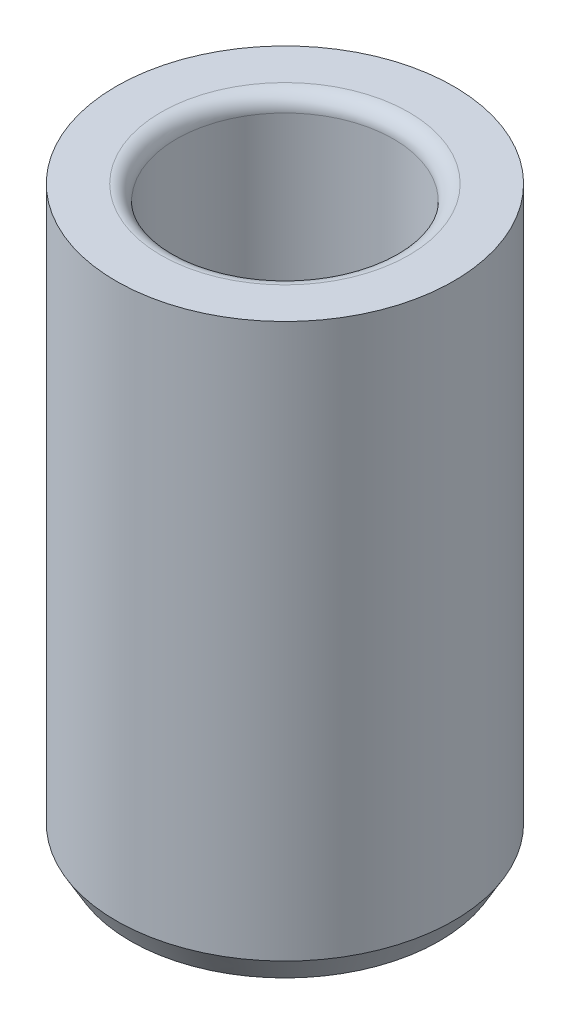
ISO-10303-21;
HEADER;
FILE_DESCRIPTION(('STEP AP214'),'2;1');
FILE_NAME('part.step','',(''),(''),'','','');
FILE_SCHEMA(('AUTOMOTIVE_DESIGN { 1 0 10303 214 1 1 1 1 }'));
ENDSEC;
DATA;
#1=APPLICATION_CONTEXT('core data for automotive mechanical design processes');
#2=APPLICATION_PROTOCOL_DEFINITION('international standard','automotive_design',2000,#1);
#3=PRODUCT_CONTEXT('',#1,'mechanical');
#4=PRODUCT('Part','Part','',(#3));
#5=PRODUCT_RELATED_PRODUCT_CATEGORY('part','',(#4));
#6=PRODUCT_DEFINITION_FORMATION('','',#4);
#7=PRODUCT_DEFINITION_CONTEXT('part definition',#1,'design');
#8=PRODUCT_DEFINITION('design','',#6,#7);
#9=PRODUCT_DEFINITION_SHAPE('','',#8);
#10=(LENGTH_UNIT() NAMED_UNIT(*) SI_UNIT(.MILLI.,.METRE.));
#11=(NAMED_UNIT(*) PLANE_ANGLE_UNIT() SI_UNIT($,.RADIAN.));
#12=(NAMED_UNIT(*) SI_UNIT($,.STERADIAN.) SOLID_ANGLE_UNIT());
#13=UNCERTAINTY_MEASURE_WITH_UNIT(LENGTH_MEASURE(1.E-05),#10,'distance_accuracy_value','');
#14=(GEOMETRIC_REPRESENTATION_CONTEXT(3) GLOBAL_UNCERTAINTY_ASSIGNED_CONTEXT((#13)) GLOBAL_UNIT_ASSIGNED_CONTEXT((#10,
#11,#12)) REPRESENTATION_CONTEXT('',''));
#15=CARTESIAN_POINT('',(0.,0.,0.));
#16=DIRECTION('',(0.,0.,1.));
#17=DIRECTION('',(1.,0.,0.));
#18=AXIS2_PLACEMENT_3D('',#15,#16,#17);
#19=CARTESIAN_POINT('',(0.,0.,0.));
#20=DIRECTION('',(0.,1.,0.));
#21=DIRECTION('',(-1.,0.,0.));
#22=AXIS2_PLACEMENT_3D('',#19,#20,#21);
#23=CYLINDRICAL_SURFACE('',#22,5.55625);
#24=CARTESIAN_POINT('',(0.,-18.2372,0.));
#25=DIRECTION('',(0.,1.,0.));
#26=DIRECTION('',(-1.,0.,0.));
#27=AXIS2_PLACEMENT_3D('',#24,#25,#26);
#28=CIRCLE('',#27,5.55625);
#29=CARTESIAN_POINT('',(-5.55625,-18.2372,0.));
#30=VERTEX_POINT('',#29);
#31=EDGE_CURVE('E40',#30,#30,#28,.T.);
#32=ORIENTED_EDGE('',*,*,#31,.T.);
#33=EDGE_LOOP('',(#32));
#34=FACE_BOUND('',#33,.T.);
#35=CARTESIAN_POINT('',(0.,0.,0.));
#36=DIRECTION('',(0.,1.,0.));
#37=DIRECTION('',(-1.,0.,0.));
#38=AXIS2_PLACEMENT_3D('',#35,#36,#37);
#39=CIRCLE('',#38,5.55625);
#40=CARTESIAN_POINT('',(-5.55625,0.,0.));
#41=VERTEX_POINT('',#40);
#42=EDGE_CURVE('E44',#41,#41,#39,.T.);
#43=ORIENTED_EDGE('',*,*,#42,.F.);
#44=EDGE_LOOP('',(#43));
#45=FACE_BOUND('',#44,.T.);
#46=ADVANCED_FACE('F33',(#34,#45),#23,.T.);
#47=CARTESIAN_POINT('',(4.079875,0.,0.));
#48=DIRECTION('',(0.,-1.,0.));
#49=DIRECTION('',(1.,0.,0.));
#50=AXIS2_PLACEMENT_3D('',#47,#48,#49);
#51=PLANE('',#50);
#52=CARTESIAN_POINT('',(0.,0.,0.));
#53=DIRECTION('',(0.,1.,0.));
#54=DIRECTION('',(-1.,0.,0.));
#55=AXIS2_PLACEMENT_3D('',#52,#53,#54);
#56=CIRCLE('',#55,4.079875);
#57=CARTESIAN_POINT('',(-4.079875,0.,0.));
#58=VERTEX_POINT('',#57);
#59=EDGE_CURVE('E48',#58,#58,#56,.T.);
#60=ORIENTED_EDGE('',*,*,#59,.F.);
#61=EDGE_LOOP('',(#60));
#62=FACE_BOUND('',#61,.T.);
#63=ORIENTED_EDGE('',*,*,#42,.T.);
#64=EDGE_LOOP('',(#63));
#65=FACE_BOUND('',#64,.T.);
#66=ADVANCED_FACE('F80',(#62,#65),#51,.F.);
#67=CARTESIAN_POINT('',(0.,-0.508000000000001,0.));
#68=DIRECTION('',(0.,1.,0.));
#69=DIRECTION('',(-1.,0.,0.));
#70=AXIS2_PLACEMENT_3D('',#67,#68,#69);
#71=TOROIDAL_SURFACE('',#70,4.079875,0.508);
#72=CARTESIAN_POINT('',(0.,-0.508000000000001,0.));
#73=DIRECTION('',(0.,1.,0.));
#74=DIRECTION('',(-1.,0.,0.));
#75=AXIS2_PLACEMENT_3D('',#72,#73,#74);
#76=CIRCLE('',#75,3.571875);
#77=CARTESIAN_POINT('',(-3.571875,-0.508000000000001,0.));
#78=VERTEX_POINT('',#77);
#79=EDGE_CURVE('E53',#78,#78,#76,.T.);
#80=ORIENTED_EDGE('',*,*,#79,.F.);
#81=EDGE_LOOP('',(#80));
#82=FACE_BOUND('',#81,.T.);
#83=ORIENTED_EDGE('',*,*,#59,.T.);
#84=EDGE_LOOP('',(#83));
#85=FACE_BOUND('',#84,.T.);
#86=ADVANCED_FACE('F74',(#82,#85),#71,.T.);
#87=CARTESIAN_POINT('',(0.,0.,0.));
#88=DIRECTION('',(0.,1.,0.));
#89=DIRECTION('',(-1.,0.,0.));
#90=AXIS2_PLACEMENT_3D('',#87,#88,#89);
#91=CYLINDRICAL_SURFACE('',#90,3.571875);
#92=CARTESIAN_POINT('',(0.,-18.669,0.));
#93=DIRECTION('',(0.,1.,0.));
#94=DIRECTION('',(-1.,0.,0.));
#95=AXIS2_PLACEMENT_3D('',#92,#93,#94);
#96=CIRCLE('',#95,3.571875);
#97=CARTESIAN_POINT('',(-3.571875,-18.669,0.));
#98=VERTEX_POINT('',#97);
#99=EDGE_CURVE('E56',#98,#98,#96,.T.);
#100=ORIENTED_EDGE('',*,*,#99,.F.);
#101=EDGE_LOOP('',(#100));
#102=FACE_BOUND('',#101,.T.);
#103=ORIENTED_EDGE('',*,*,#79,.T.);
#104=EDGE_LOOP('',(#103));
#105=FACE_BOUND('',#104,.T.);
#106=ADVANCED_FACE('F68',(#102,#105),#91,.F.);
#107=CARTESIAN_POINT('',(0.,-18.669,0.));
#108=DIRECTION('',(0.,-1.,0.));
#109=DIRECTION('',(1.,0.,0.));
#110=AXIS2_PLACEMENT_3D('',#107,#108,#109);
#111=CONICAL_SURFACE('',#110,3.571875,0.78539816339745);
#112=CARTESIAN_POINT('',(0.,-19.05,0.));
#113=DIRECTION('',(0.,1.,0.));
#114=DIRECTION('',(-1.,0.,0.));
#115=AXIS2_PLACEMENT_3D('',#112,#113,#114);
#116=CIRCLE('',#115,3.952875);
#117=CARTESIAN_POINT('',(-3.952875,-19.05,0.));
#118=VERTEX_POINT('',#117);
#119=EDGE_CURVE('E59',#118,#118,#116,.T.);
#120=ORIENTED_EDGE('',*,*,#119,.F.);
#121=EDGE_LOOP('',(#120));
#122=FACE_BOUND('',#121,.T.);
#123=ORIENTED_EDGE('',*,*,#99,.T.);
#124=EDGE_LOOP('',(#123));
#125=FACE_BOUND('',#124,.T.);
#126=ADVANCED_FACE('F65',(#122,#125),#111,.F.);
#127=CARTESIAN_POINT('',(3.952875,-19.05,0.));
#128=DIRECTION('',(0.,1.,0.));
#129=DIRECTION('',(-1.,0.,0.));
#130=AXIS2_PLACEMENT_3D('',#127,#128,#129);
#131=PLANE('',#130);
#132=CARTESIAN_POINT('',(0.,-19.05,0.));
#133=DIRECTION('',(0.,1.,0.));
#134=DIRECTION('',(-1.,0.,0.));
#135=AXIS2_PLACEMENT_3D('',#132,#133,#134);
#136=CIRCLE('',#135,5.08697970120267);
#137=CARTESIAN_POINT('',(-5.08697970120267,-19.05,0.));
#138=VERTEX_POINT('',#137);
#139=EDGE_CURVE('E10',#138,#138,#136,.F.);
#140=ORIENTED_EDGE('',*,*,#139,.T.);
#141=EDGE_LOOP('',(#140));
#142=FACE_BOUND('',#141,.T.);
#143=ORIENTED_EDGE('',*,*,#119,.T.);
#144=EDGE_LOOP('',(#143));
#145=FACE_BOUND('',#144,.T.);
#146=ADVANCED_FACE('F63',(#142,#145),#131,.F.);
#147=CARTESIAN_POINT('',(0.,-18.2372,0.));
#148=DIRECTION('',(0.,1.,0.));
#149=DIRECTION('',(-1.,0.,0.));
#150=AXIS2_PLACEMENT_3D('',#147,#148,#149);
#151=CONICAL_SURFACE('',#150,5.55625,0.523598775598296);
#152=CARTESIAN_POINT('',(-5.08697970120267,-19.05,0.));
#153=CARTESIAN_POINT('',(-5.09186793348181,-19.0415333333333,0.));
#154=CARTESIAN_POINT('',(-5.09675616576095,-19.0330666666667,0.));
#155=CARTESIAN_POINT('',(-5.10653263031923,-19.0161333333333,0.));
#156=CARTESIAN_POINT('',(-5.11142086259837,-19.0076666666667,0.));
#157=CARTESIAN_POINT('',(-5.12119732715664,-18.9907333333333,0.));
#158=CARTESIAN_POINT('',(-5.12608555943578,-18.9822666666667,0.));
#159=CARTESIAN_POINT('',(-5.13586202399406,-18.9653333333333,0.));
#160=CARTESIAN_POINT('',(-5.1407502562732,-18.9568666666667,0.));
#161=CARTESIAN_POINT('',(-5.15052672083148,-18.9399333333333,0.));
#162=CARTESIAN_POINT('',(-5.15541495311061,-18.9314666666667,0.));
#163=CARTESIAN_POINT('',(-5.16519141766889,-18.9145333333333,0.));
#164=CARTESIAN_POINT('',(-5.17007964994803,-18.9060666666667,0.));
#165=CARTESIAN_POINT('',(-5.17985611450631,-18.8891333333333,0.));
#166=CARTESIAN_POINT('',(-5.18474434678545,-18.8806666666667,0.));
#167=CARTESIAN_POINT('',(-5.19452081134373,-18.8637333333333,0.));
#168=CARTESIAN_POINT('',(-5.19940904362286,-18.8552666666667,0.));
#169=CARTESIAN_POINT('',(-5.20918550818114,-18.8383333333333,0.));
#170=CARTESIAN_POINT('',(-5.21407374046028,-18.8298666666667,0.));
#171=CARTESIAN_POINT('',(-5.22385020501856,-18.8129333333333,0.));
#172=CARTESIAN_POINT('',(-5.2287384372977,-18.8044666666667,0.));
#173=CARTESIAN_POINT('',(-5.23851490185598,-18.7875333333333,0.));
#174=CARTESIAN_POINT('',(-5.24340313413511,-18.7790666666667,0.));
#175=CARTESIAN_POINT('',(-5.25317959869339,-18.7621333333333,0.));
#176=CARTESIAN_POINT('',(-5.25806783097253,-18.7536666666667,0.));
#177=CARTESIAN_POINT('',(-5.26784429553081,-18.7367333333333,0.));
#178=CARTESIAN_POINT('',(-5.27273252780995,-18.7282666666667,0.));
#179=CARTESIAN_POINT('',(-5.28250899236822,-18.7113333333333,0.));
#180=CARTESIAN_POINT('',(-5.28739722464736,-18.7028666666667,0.));
#181=CARTESIAN_POINT('',(-5.29717368920564,-18.6859333333333,0.));
#182=CARTESIAN_POINT('',(-5.30206192148478,-18.6774666666667,0.));
#183=CARTESIAN_POINT('',(-5.31183838604306,-18.6605333333333,0.));
#184=CARTESIAN_POINT('',(-5.31672661832219,-18.6520666666667,0.));
#185=CARTESIAN_POINT('',(-5.32650308288047,-18.6351333333333,0.));
#186=CARTESIAN_POINT('',(-5.33139131515961,-18.6266666666667,0.));
#187=CARTESIAN_POINT('',(-5.34116777971789,-18.6097333333333,0.));
#188=CARTESIAN_POINT('',(-5.34605601199703,-18.6012666666667,0.));
#189=CARTESIAN_POINT('',(-5.3558324765553,-18.5843333333333,0.));
#190=CARTESIAN_POINT('',(-5.36072070883444,-18.5758666666667,0.));
#191=CARTESIAN_POINT('',(-5.37049717339272,-18.5589333333333,0.));
#192=CARTESIAN_POINT('',(-5.37538540567186,-18.5504666666667,0.));
#193=CARTESIAN_POINT('',(-5.38516187023014,-18.5335333333333,0.));
#194=CARTESIAN_POINT('',(-5.39005010250928,-18.5250666666667,0.));
#195=CARTESIAN_POINT('',(-5.39982656706756,-18.5081333333333,0.));
#196=CARTESIAN_POINT('',(-5.40471479934669,-18.4996666666667,0.));
#197=CARTESIAN_POINT('',(-5.41449126390497,-18.4827333333333,0.));
#198=CARTESIAN_POINT('',(-5.41937949618411,-18.4742666666667,0.));
#199=CARTESIAN_POINT('',(-5.42915596074239,-18.4573333333333,0.));
#200=CARTESIAN_POINT('',(-5.43404419302153,-18.4488666666667,0.));
#201=CARTESIAN_POINT('',(-5.4438206575798,-18.4319333333333,0.));
#202=CARTESIAN_POINT('',(-5.44870888985894,-18.4234666666667,0.));
#203=CARTESIAN_POINT('',(-5.45848535441722,-18.4065333333333,0.));
#204=CARTESIAN_POINT('',(-5.46337358669636,-18.3980666666667,0.));
#205=CARTESIAN_POINT('',(-5.47315005125464,-18.3811333333333,0.));
#206=CARTESIAN_POINT('',(-5.47803828353378,-18.3726666666667,0.));
#207=CARTESIAN_POINT('',(-5.48781474809205,-18.3557333333333,0.));
#208=CARTESIAN_POINT('',(-5.49270298037119,-18.3472666666667,0.));
#209=CARTESIAN_POINT('',(-5.50247944492947,-18.3303333333333,0.));
#210=CARTESIAN_POINT('',(-5.50736767720861,-18.3218666666667,0.));
#211=CARTESIAN_POINT('',(-5.51714414176689,-18.3049333333333,0.));
#212=CARTESIAN_POINT('',(-5.52203237404602,-18.2964666666667,0.));
#213=CARTESIAN_POINT('',(-5.5318088386043,-18.2795333333333,0.));
#214=CARTESIAN_POINT('',(-5.53669707088344,-18.2710666666667,0.));
#215=CARTESIAN_POINT('',(-5.54647353544172,-18.2541333333333,0.));
#216=CARTESIAN_POINT('',(-5.55136176772086,-18.2456666666667,0.));
#217=CARTESIAN_POINT('',(-5.55625,-18.2372,0.));
#218=B_SPLINE_CURVE_WITH_KNOTS('',3,(#152,#153,#154,#155,#156,#157,#158,#159,#160,#161,#162,
#163,#164,#165,#166,#167,#168,#169,#170,#171,#172,#173,#174,#175,#176,#177,#178,#179,#180,#181,
#182,#183,#184,#185,#186,#187,#188,#189,#190,#191,#192,#193,#194,#195,#196,#197,#198,#199,#200,
#201,#202,#203,#204,#205,#206,#207,#208,#209,#210,#211,#212,#213,#214,#215,#216,#217),
.UNSPECIFIED.,.F.,.F.,(4,2,2,2,2,2,2,2,2,2,2,2,2,2,2,2,2,2,2,2,2,2,2,2,2,2,2,2,2,2,2,2,4),(0.,
0.0293293936748313,0.0586587873496631,0.0879881810244974,0.117317574699329,0.146646968374164,
0.175976362048995,0.20530575572383,0.234635149398661,0.263964543073495,0.293293936748327,
0.322623330423161,0.351952724097993,0.381282117772828,0.410611511447659,0.439940905122493,
0.469270298797325,0.498599692472156,0.527929086146991,0.557258479821823,0.586587873496657,
0.615917267171489,0.645246660846323,0.674576054521154,0.703905448195989,0.73323484187082,
0.762564235545655,0.791893629220486,0.821223022895321,0.850552416570153,0.879881810244987,
0.909211203919818,0.938540597594653),.UNSPECIFIED.);
#219=EDGE_CURVE('BSEAM35',#138,#30,#218,.T.);
#220=ORIENTED_EDGE('',*,*,#139,.F.);
#221=ORIENTED_EDGE('',*,*,#31,.F.);
#222=ORIENTED_EDGE('',*,*,#219,.T.);
#223=ORIENTED_EDGE('',*,*,#219,.F.);
#224=EDGE_LOOP('',(#220,#222,#221,#223));
#225=FACE_BOUND('',#224,.T.);
#226=ADVANCED_FACE('F35',(#225),#151,.T.);
#227=CLOSED_SHELL('',(#46,#66,#86,#106,#126,#146,#226));
#228=MANIFOLD_SOLID_BREP('B2',#227);
#229=ADVANCED_BREP_SHAPE_REPRESENTATION('',(#18,#228),#14);
#230=SHAPE_DEFINITION_REPRESENTATION(#9,#229);
ENDSEC;
END-ISO-10303-21;
